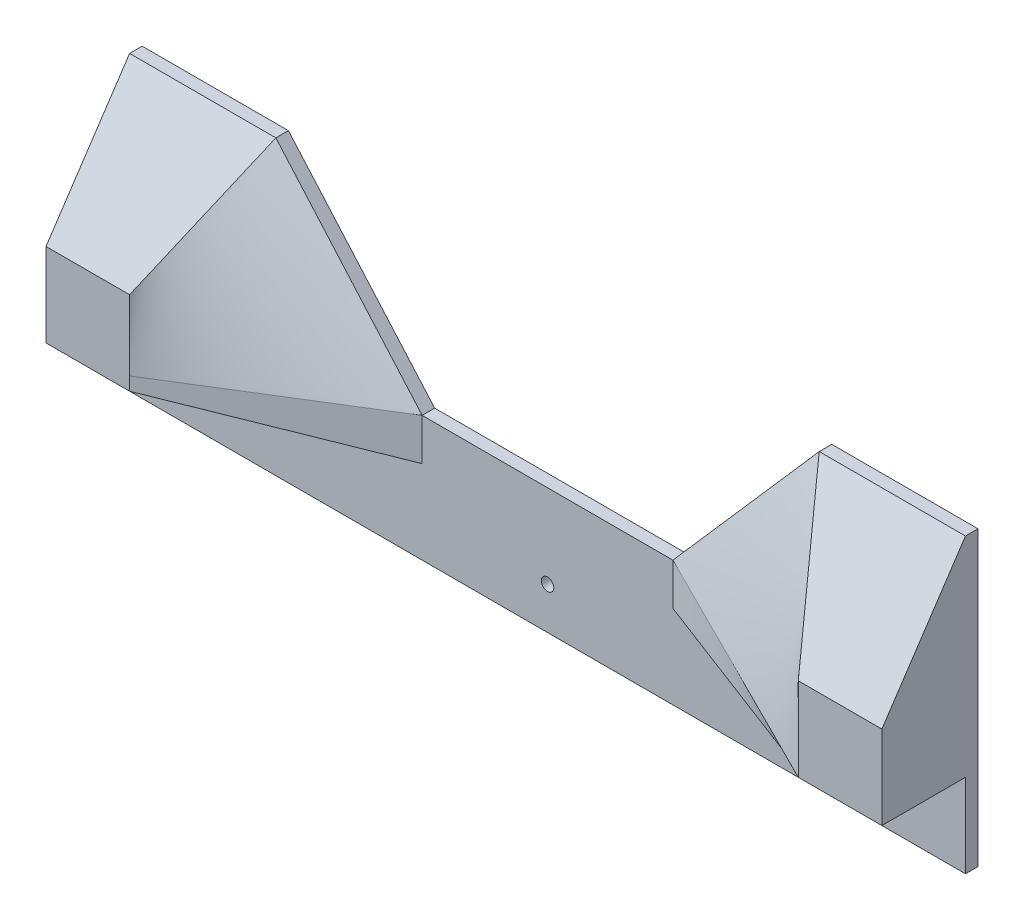
ISO-10303-21;
HEADER;
FILE_DESCRIPTION(('STEP AP214'),'2;1');
FILE_NAME('part.step','',(''),(''),'','','');
FILE_SCHEMA(('AUTOMOTIVE_DESIGN { 1 0 10303 214 1 1 1 1 }'));
ENDSEC;
DATA;
#1=APPLICATION_CONTEXT('core data for automotive mechanical design processes');
#2=APPLICATION_PROTOCOL_DEFINITION('international standard','automotive_design',2000,#1);
#3=PRODUCT_CONTEXT('',#1,'mechanical');
#4=PRODUCT('Part','Part','',(#3));
#5=PRODUCT_RELATED_PRODUCT_CATEGORY('part','',(#4));
#6=PRODUCT_DEFINITION_FORMATION('','',#4);
#7=PRODUCT_DEFINITION_CONTEXT('part definition',#1,'design');
#8=PRODUCT_DEFINITION('design','',#6,#7);
#9=PRODUCT_DEFINITION_SHAPE('','',#8);
#10=(LENGTH_UNIT() NAMED_UNIT(*) SI_UNIT(.MILLI.,.METRE.));
#11=(NAMED_UNIT(*) PLANE_ANGLE_UNIT() SI_UNIT($,.RADIAN.));
#12=(NAMED_UNIT(*) SI_UNIT($,.STERADIAN.) SOLID_ANGLE_UNIT());
#13=UNCERTAINTY_MEASURE_WITH_UNIT(LENGTH_MEASURE(1.E-05),#10,'distance_accuracy_value','');
#14=(GEOMETRIC_REPRESENTATION_CONTEXT(3) GLOBAL_UNCERTAINTY_ASSIGNED_CONTEXT((#13)) GLOBAL_UNIT_ASSIGNED_CONTEXT((#10,
#11,#12)) REPRESENTATION_CONTEXT('',''));
#15=CARTESIAN_POINT('',(0.,0.,0.));
#16=DIRECTION('',(0.,0.,1.));
#17=DIRECTION('',(1.,0.,0.));
#18=AXIS2_PLACEMENT_3D('',#15,#16,#17);
#19=CARTESIAN_POINT('',(0.,0.,3.));
#20=DIRECTION('',(0.,0.,1.));
#21=DIRECTION('',(1.,0.,0.));
#22=AXIS2_PLACEMENT_3D('',#19,#20,#21);
#23=PLANE('',#22);
#24=CARTESIAN_POINT('',(185.,-20.,3.));
#25=DIRECTION('',(0.,0.,1.));
#26=DIRECTION('',(1.,0.,0.));
#27=AXIS2_PLACEMENT_3D('',#24,#25,#26);
#28=CIRCLE('',#27,1.5);
#29=CARTESIAN_POINT('',(186.5,-20.,3.));
#30=VERTEX_POINT('',#29);
#31=EDGE_CURVE('E412',#30,#30,#28,.T.);
#32=ORIENTED_EDGE('',*,*,#31,.F.);
#33=EDGE_LOOP('',(#32));
#34=FACE_BOUND('',#33,.T.);
#35=CARTESIAN_POINT('',(100.,-20.,3.));
#36=DIRECTION('',(0.,0.,1.));
#37=DIRECTION('',(1.,0.,0.));
#38=AXIS2_PLACEMENT_3D('',#35,#36,#37);
#39=CIRCLE('',#38,1.5);
#40=CARTESIAN_POINT('',(101.5,-20.,3.));
#41=VERTEX_POINT('',#40);
#42=EDGE_CURVE('E415',#41,#41,#39,.T.);
#43=ORIENTED_EDGE('',*,*,#42,.F.);
#44=EDGE_LOOP('',(#43));
#45=FACE_BOUND('',#44,.T.);
#46=CARTESIAN_POINT('',(15.,-20.,3.));
#47=DIRECTION('',(0.,0.,1.));
#48=DIRECTION('',(-1.,0.,0.));
#49=AXIS2_PLACEMENT_3D('',#46,#47,#48);
#50=CIRCLE('',#49,1.5);
#51=CARTESIAN_POINT('',(16.5,-20.,3.));
#52=VERTEX_POINT('',#51);
#53=EDGE_CURVE('E421',#52,#52,#50,.T.);
#54=ORIENTED_EDGE('',*,*,#53,.F.);
#55=EDGE_LOOP('',(#54));
#56=FACE_BOUND('',#55,.T.);
#57=DIRECTION('',(1.,0.,0.));
#58=VECTOR('',#57,1.);
#59=CARTESIAN_POINT('',(200.,-10.,3.));
#60=LINE('',#59,#58);
#61=CARTESIAN_POINT('',(130.,-10.,3.));
#62=VERTEX_POINT('',#61);
#63=CARTESIAN_POINT('',(200.,-10.,3.));
#64=VERTEX_POINT('',#63);
#65=EDGE_CURVE('E116',#62,#64,#60,.T.);
#66=ORIENTED_EDGE('',*,*,#65,.F.);
#67=DIRECTION('',(0.,-1.,0.));
#68=VECTOR('',#67,1.);
#69=CARTESIAN_POINT('',(130.,0.,3.));
#70=LINE('',#69,#68);
#71=CARTESIAN_POINT('',(130.,0.,3.));
#72=VERTEX_POINT('',#71);
#73=EDGE_CURVE('E200',#72,#62,#70,.T.);
#74=ORIENTED_EDGE('',*,*,#73,.F.);
#75=DIRECTION('',(1.,0.,0.));
#76=VECTOR('',#75,1.);
#77=CARTESIAN_POINT('',(0.,0.,3.));
#78=LINE('',#77,#76);
#79=CARTESIAN_POINT('',(70.,0.,3.00000000000001));
#80=VERTEX_POINT('',#79);
#81=EDGE_CURVE('E190',#80,#72,#78,.T.);
#82=ORIENTED_EDGE('',*,*,#81,.F.);
#83=DIRECTION('',(0.,1.,0.));
#84=VECTOR('',#83,1.);
#85=CARTESIAN_POINT('',(70.,-10.,3.));
#86=LINE('',#85,#84);
#87=CARTESIAN_POINT('',(70.,-10.,3.));
#88=VERTEX_POINT('',#87);
#89=EDGE_CURVE('E198',#88,#80,#86,.T.);
#90=ORIENTED_EDGE('',*,*,#89,.F.);
#91=DIRECTION('',(1.,0.,0.));
#92=VECTOR('',#91,1.);
#93=CARTESIAN_POINT('',(0.,-10.,3.));
#94=LINE('',#93,#92);
#95=CARTESIAN_POINT('',(0.,-10.,3.));
#96=VERTEX_POINT('',#95);
#97=EDGE_CURVE('E339',#96,#88,#94,.T.);
#98=ORIENTED_EDGE('',*,*,#97,.F.);
#99=DIRECTION('',(0.,-1.,0.));
#100=VECTOR('',#99,1.);
#101=CARTESIAN_POINT('',(0.,0.,3.));
#102=LINE('',#101,#100);
#103=CARTESIAN_POINT('',(0.,-30.,3.));
#104=VERTEX_POINT('',#103);
#105=EDGE_CURVE('E347',#96,#104,#102,.T.);
#106=ORIENTED_EDGE('',*,*,#105,.T.);
#107=DIRECTION('',(1.,0.,0.));
#108=VECTOR('',#107,1.);
#109=CARTESIAN_POINT('',(0.,-30.,3.));
#110=LINE('',#109,#108);
#111=CARTESIAN_POINT('',(200.,-30.,3.));
#112=VERTEX_POINT('',#111);
#113=EDGE_CURVE('E350',#104,#112,#110,.T.);
#114=ORIENTED_EDGE('',*,*,#113,.T.);
#115=DIRECTION('',(0.,-1.,0.));
#116=VECTOR('',#115,1.);
#117=CARTESIAN_POINT('',(200.,0.,3.));
#118=LINE('',#117,#116);
#119=EDGE_CURVE('E381',#64,#112,#118,.T.);
#120=ORIENTED_EDGE('',*,*,#119,.F.);
#121=EDGE_LOOP('',(#66,#74,#82,#90,#98,#106,#114,#120));
#122=FACE_BOUND('',#121,.T.);
#123=ADVANCED_FACE('F72',(#34,#45,#56,#122),#23,.T.);
#124=CARTESIAN_POINT('',(200.,0.,3.));
#125=DIRECTION('',(1.,0.,0.));
#126=DIRECTION('',(0.,0.,-1.));
#127=AXIS2_PLACEMENT_3D('',#124,#125,#126);
#128=PLANE('',#127);
#129=DIRECTION('',(0.,0.832050294337844,-0.554700196225229));
#130=VECTOR('',#129,1.);
#131=CARTESIAN_POINT('',(200.,10.,23.));
#132=LINE('',#131,#130);
#133=CARTESIAN_POINT('',(200.,10.,23.));
#134=VERTEX_POINT('',#133);
#135=CARTESIAN_POINT('',(200.,40.,3.));
#136=VERTEX_POINT('',#135);
#137=EDGE_CURVE('E105',#134,#136,#132,.T.);
#138=ORIENTED_EDGE('',*,*,#137,.F.);
#139=DIRECTION('',(0.,1.,0.));
#140=VECTOR('',#139,1.);
#141=CARTESIAN_POINT('',(200.,-10.,23.));
#142=LINE('',#141,#140);
#143=CARTESIAN_POINT('',(200.,-10.,23.));
#144=VERTEX_POINT('',#143);
#145=EDGE_CURVE('E391',#144,#134,#142,.T.);
#146=ORIENTED_EDGE('',*,*,#145,.F.);
#147=DIRECTION('',(0.,0.,-1.));
#148=VECTOR('',#147,1.);
#149=CARTESIAN_POINT('',(200.,-10.,23.));
#150=LINE('',#149,#148);
#151=EDGE_CURVE('E220',#144,#64,#150,.T.);
#152=ORIENTED_EDGE('',*,*,#151,.T.);
#153=ORIENTED_EDGE('',*,*,#119,.T.);
#154=DIRECTION('',(0.,0.,-1.));
#155=VECTOR('',#154,1.);
#156=CARTESIAN_POINT('',(200.,-30.,3.));
#157=LINE('',#156,#155);
#158=CARTESIAN_POINT('',(200.,-30.,0.));
#159=VERTEX_POINT('',#158);
#160=EDGE_CURVE('E360',#112,#159,#157,.T.);
#161=ORIENTED_EDGE('',*,*,#160,.T.);
#162=DIRECTION('',(0.,-1.,0.));
#163=VECTOR('',#162,1.);
#164=CARTESIAN_POINT('',(200.,0.,0.));
#165=LINE('',#164,#163);
#166=CARTESIAN_POINT('',(200.,40.,0.));
#167=VERTEX_POINT('',#166);
#168=EDGE_CURVE('E361',#167,#159,#165,.T.);
#169=ORIENTED_EDGE('',*,*,#168,.F.);
#170=DIRECTION('',(0.,0.,-1.));
#171=VECTOR('',#170,1.);
#172=CARTESIAN_POINT('',(200.,40.,3.));
#173=LINE('',#172,#171);
#174=EDGE_CURVE('E82',#136,#167,#173,.T.);
#175=ORIENTED_EDGE('',*,*,#174,.F.);
#176=EDGE_LOOP('',(#138,#146,#152,#153,#161,#169,#175));
#177=FACE_BOUND('',#176,.T.);
#178=ADVANCED_FACE('F74',(#177),#128,.T.);
#179=CARTESIAN_POINT('',(0.,40.,3.));
#180=DIRECTION('',(0.,-1.,0.));
#181=DIRECTION('',(1.,0.,0.));
#182=AXIS2_PLACEMENT_3D('',#179,#180,#181);
#183=PLANE('',#182);
#184=DIRECTION('',(-1.,0.,0.));
#185=VECTOR('',#184,1.);
#186=CARTESIAN_POINT('',(0.,40.,0.));
#187=LINE('',#186,#185);
#188=CARTESIAN_POINT('',(165.,40.,0.));
#189=VERTEX_POINT('',#188);
#190=EDGE_CURVE('E364',#167,#189,#187,.T.);
#191=ORIENTED_EDGE('',*,*,#190,.T.);
#192=DIRECTION('',(0.,0.,-1.));
#193=VECTOR('',#192,1.);
#194=CARTESIAN_POINT('',(165.,40.,3.));
#195=LINE('',#194,#193);
#196=CARTESIAN_POINT('',(165.,40.,3.));
#197=VERTEX_POINT('',#196);
#198=EDGE_CURVE('E402',#197,#189,#195,.T.);
#199=ORIENTED_EDGE('',*,*,#198,.F.);
#200=DIRECTION('',(1.,0.,0.));
#201=VECTOR('',#200,1.);
#202=CARTESIAN_POINT('',(0.,40.,2.99999999999999));
#203=LINE('',#202,#201);
#204=EDGE_CURVE('E400',#136,#197,#203,.F.);
#205=ORIENTED_EDGE('',*,*,#204,.F.);
#206=ORIENTED_EDGE('',*,*,#174,.T.);
#207=EDGE_LOOP('',(#191,#199,#205,#206));
#208=FACE_BOUND('',#207,.T.);
#209=ADVANCED_FACE('F436',(#208),#183,.F.);
#210=CARTESIAN_POINT('',(73.6283185840708,-64.424778761062,3.));
#211=DIRECTION('',(0.752576694706878,-0.658504607868518,0.));
#212=DIRECTION('',(0.658504607868518,0.752576694706878,0.));
#213=AXIS2_PLACEMENT_3D('',#210,#211,#212);
#214=PLANE('',#213);
#215=DIRECTION('',(-0.658504607868518,-0.752576694706878,0.));
#216=VECTOR('',#215,1.);
#217=CARTESIAN_POINT('',(73.6283185840708,-64.424778761062,0.));
#218=LINE('',#217,#216);
#219=CARTESIAN_POINT('',(130.,0.,0.));
#220=VERTEX_POINT('',#219);
#221=EDGE_CURVE('E367',#189,#220,#218,.T.);
#222=ORIENTED_EDGE('',*,*,#221,.T.);
#223=DIRECTION('',(0.,0.,-1.));
#224=VECTOR('',#223,1.);
#225=CARTESIAN_POINT('',(130.,0.,3.));
#226=LINE('',#225,#224);
#227=EDGE_CURVE('E194',#72,#220,#226,.T.);
#228=ORIENTED_EDGE('',*,*,#227,.F.);
#229=DIRECTION('',(0.658504607868518,0.752576694706878,0.));
#230=VECTOR('',#229,1.);
#231=CARTESIAN_POINT('',(73.6283185840708,-64.424778761062,3.));
#232=LINE('',#231,#230);
#233=EDGE_CURVE('E203',#197,#72,#232,.F.);
#234=ORIENTED_EDGE('',*,*,#233,.F.);
#235=ORIENTED_EDGE('',*,*,#198,.T.);
#236=EDGE_LOOP('',(#222,#228,#234,#235));
#237=FACE_BOUND('',#236,.T.);
#238=ADVANCED_FACE('F463',(#237),#214,.F.);
#239=CARTESIAN_POINT('',(0.,0.,3.));
#240=DIRECTION('',(0.,1.,0.));
#241=DIRECTION('',(0.,0.,1.));
#242=AXIS2_PLACEMENT_3D('',#239,#240,#241);
#243=PLANE('',#242);
#244=DIRECTION('',(1.,0.,0.));
#245=VECTOR('',#244,1.);
#246=CARTESIAN_POINT('',(0.,0.,0.));
#247=LINE('',#246,#245);
#248=CARTESIAN_POINT('',(70.,0.,0.));
#249=VERTEX_POINT('',#248);
#250=EDGE_CURVE('E192',#249,#220,#247,.T.);
#251=ORIENTED_EDGE('',*,*,#250,.F.);
#252=DIRECTION('',(0.,0.,-1.));
#253=VECTOR('',#252,1.);
#254=CARTESIAN_POINT('',(70.,0.,3.));
#255=LINE('',#254,#253);
#256=EDGE_CURVE('E187',#80,#249,#255,.T.);
#257=ORIENTED_EDGE('',*,*,#256,.F.);
#258=ORIENTED_EDGE('',*,*,#81,.T.);
#259=ORIENTED_EDGE('',*,*,#227,.T.);
#260=EDGE_LOOP('',(#251,#257,#258,#259));
#261=FACE_BOUND('',#260,.T.);
#262=ADVANCED_FACE('F189',(#261),#243,.T.);
#263=CARTESIAN_POINT('',(39.646017699115,34.6902654867257,3.));
#264=DIRECTION('',(0.752576694706878,0.658504607868518,0.));
#265=DIRECTION('',(-0.658504607868518,0.752576694706878,0.));
#266=AXIS2_PLACEMENT_3D('',#263,#264,#265);
#267=PLANE('',#266);
#268=DIRECTION('',(0.658504607868518,-0.752576694706878,0.));
#269=VECTOR('',#268,1.);
#270=CARTESIAN_POINT('',(39.646017699115,34.6902654867257,0.));
#271=LINE('',#270,#269);
#272=CARTESIAN_POINT('',(35.,40.,0.));
#273=VERTEX_POINT('',#272);
#274=EDGE_CURVE('E371',#273,#249,#271,.T.);
#275=ORIENTED_EDGE('',*,*,#274,.F.);
#276=DIRECTION('',(0.,0.,-1.));
#277=VECTOR('',#276,1.);
#278=CARTESIAN_POINT('',(35.,40.,3.));
#279=LINE('',#278,#277);
#280=CARTESIAN_POINT('',(35.,40.,3.));
#281=VERTEX_POINT('',#280);
#282=EDGE_CURVE('E181',#281,#273,#279,.T.);
#283=ORIENTED_EDGE('',*,*,#282,.F.);
#284=DIRECTION('',(-0.658504607868518,0.752576694706878,0.));
#285=VECTOR('',#284,1.);
#286=CARTESIAN_POINT('',(39.646017699115,34.6902654867257,3.));
#287=LINE('',#286,#285);
#288=EDGE_CURVE('E202',#281,#80,#287,.F.);
#289=ORIENTED_EDGE('',*,*,#288,.T.);
#290=ORIENTED_EDGE('',*,*,#256,.T.);
#291=EDGE_LOOP('',(#275,#283,#289,#290));
#292=FACE_BOUND('',#291,.T.);
#293=ADVANCED_FACE('F206',(#292),#267,.T.);
#294=CARTESIAN_POINT('',(0.,40.,3.));
#295=DIRECTION('',(0.,1.,0.));
#296=DIRECTION('',(-1.,0.,0.));
#297=AXIS2_PLACEMENT_3D('',#294,#295,#296);
#298=PLANE('',#297);
#299=DIRECTION('',(1.,0.,0.));
#300=VECTOR('',#299,1.);
#301=CARTESIAN_POINT('',(0.,40.,0.));
#302=LINE('',#301,#300);
#303=CARTESIAN_POINT('',(0.,40.,0.));
#304=VERTEX_POINT('',#303);
#305=EDGE_CURVE('E373',#304,#273,#302,.T.);
#306=ORIENTED_EDGE('',*,*,#305,.F.);
#307=DIRECTION('',(0.,0.,-1.));
#308=VECTOR('',#307,1.);
#309=CARTESIAN_POINT('',(0.,40.,3.));
#310=LINE('',#309,#308);
#311=CARTESIAN_POINT('',(0.,40.,3.));
#312=VERTEX_POINT('',#311);
#313=EDGE_CURVE('E385',#312,#304,#310,.T.);
#314=ORIENTED_EDGE('',*,*,#313,.F.);
#315=DIRECTION('',(-1.,0.,0.));
#316=VECTOR('',#315,1.);
#317=CARTESIAN_POINT('',(0.,40.,3.));
#318=LINE('',#317,#316);
#319=EDGE_CURVE('E211',#312,#281,#318,.F.);
#320=ORIENTED_EDGE('',*,*,#319,.T.);
#321=ORIENTED_EDGE('',*,*,#282,.T.);
#322=EDGE_LOOP('',(#306,#314,#320,#321));
#323=FACE_BOUND('',#322,.T.);
#324=ADVANCED_FACE('F454',(#323),#298,.T.);
#325=CARTESIAN_POINT('',(0.,0.,3.));
#326=DIRECTION('',(1.,0.,0.));
#327=DIRECTION('',(0.,1.,0.));
#328=AXIS2_PLACEMENT_3D('',#325,#326,#327);
#329=PLANE('',#328);
#330=DIRECTION('',(0.,-1.,0.));
#331=VECTOR('',#330,1.);
#332=CARTESIAN_POINT('',(0.,-10.,23.));
#333=LINE('',#332,#331);
#334=CARTESIAN_POINT('',(0.,10.,23.));
#335=VERTEX_POINT('',#334);
#336=CARTESIAN_POINT('',(0.,-10.,23.));
#337=VERTEX_POINT('',#336);
#338=EDGE_CURVE('E306',#335,#337,#333,.T.);
#339=ORIENTED_EDGE('',*,*,#338,.F.);
#340=DIRECTION('',(0.,-0.832050294337844,0.554700196225229));
#341=VECTOR('',#340,1.);
#342=CARTESIAN_POINT('',(0.,25.,13.));
#343=LINE('',#342,#341);
#344=EDGE_CURVE('E229',#312,#335,#343,.T.);
#345=ORIENTED_EDGE('',*,*,#344,.F.);
#346=ORIENTED_EDGE('',*,*,#313,.T.);
#347=DIRECTION('',(0.,-1.,0.));
#348=VECTOR('',#347,1.);
#349=CARTESIAN_POINT('',(0.,0.,0.));
#350=LINE('',#349,#348);
#351=CARTESIAN_POINT('',(0.,-30.,0.));
#352=VERTEX_POINT('',#351);
#353=EDGE_CURVE('E376',#304,#352,#350,.T.);
#354=ORIENTED_EDGE('',*,*,#353,.T.);
#355=DIRECTION('',(0.,0.,-1.));
#356=VECTOR('',#355,1.);
#357=CARTESIAN_POINT('',(0.,-30.,3.));
#358=LINE('',#357,#356);
#359=EDGE_CURVE('E383',#104,#352,#358,.T.);
#360=ORIENTED_EDGE('',*,*,#359,.F.);
#361=ORIENTED_EDGE('',*,*,#105,.F.);
#362=DIRECTION('',(0.,0.,-1.));
#363=VECTOR('',#362,1.);
#364=CARTESIAN_POINT('',(0.,-10.,23.));
#365=LINE('',#364,#363);
#366=EDGE_CURVE('E337',#337,#96,#365,.T.);
#367=ORIENTED_EDGE('',*,*,#366,.F.);
#368=EDGE_LOOP('',(#339,#345,#346,#354,#360,#361,#367));
#369=FACE_BOUND('',#368,.T.);
#370=ADVANCED_FACE('F450',(#369),#329,.F.);
#371=CARTESIAN_POINT('',(0.,-30.,3.));
#372=DIRECTION('',(0.,1.,0.));
#373=DIRECTION('',(0.,0.,1.));
#374=AXIS2_PLACEMENT_3D('',#371,#372,#373);
#375=PLANE('',#374);
#376=DIRECTION('',(1.,0.,0.));
#377=VECTOR('',#376,1.);
#378=CARTESIAN_POINT('',(0.,-30.,0.));
#379=LINE('',#378,#377);
#380=EDGE_CURVE('E378',#352,#159,#379,.T.);
#381=ORIENTED_EDGE('',*,*,#380,.T.);
#382=ORIENTED_EDGE('',*,*,#160,.F.);
#383=ORIENTED_EDGE('',*,*,#113,.F.);
#384=ORIENTED_EDGE('',*,*,#359,.T.);
#385=EDGE_LOOP('',(#381,#382,#383,#384));
#386=FACE_BOUND('',#385,.T.);
#387=ADVANCED_FACE('F446',(#386),#375,.F.);
#388=CARTESIAN_POINT('',(0.,0.,0.));
#389=DIRECTION('',(0.,0.,1.));
#390=DIRECTION('',(1.,0.,0.));
#391=AXIS2_PLACEMENT_3D('',#388,#389,#390);
#392=PLANE('',#391);
#393=CARTESIAN_POINT('',(185.,-20.,0.));
#394=DIRECTION('',(0.,0.,1.));
#395=DIRECTION('',(1.,0.,0.));
#396=AXIS2_PLACEMENT_3D('',#393,#394,#395);
#397=CIRCLE('',#396,1.5);
#398=CARTESIAN_POINT('',(186.5,-20.,0.));
#399=VERTEX_POINT('',#398);
#400=EDGE_CURVE('E365',#399,#399,#397,.F.);
#401=ORIENTED_EDGE('',*,*,#400,.F.);
#402=EDGE_LOOP('',(#401));
#403=FACE_BOUND('',#402,.T.);
#404=CARTESIAN_POINT('',(100.,-20.,0.));
#405=DIRECTION('',(0.,0.,1.));
#406=DIRECTION('',(1.,0.,0.));
#407=AXIS2_PLACEMENT_3D('',#404,#405,#406);
#408=CIRCLE('',#407,1.5);
#409=CARTESIAN_POINT('',(101.5,-20.,0.));
#410=VERTEX_POINT('',#409);
#411=EDGE_CURVE('E418',#410,#410,#408,.F.);
#412=ORIENTED_EDGE('',*,*,#411,.F.);
#413=EDGE_LOOP('',(#412));
#414=FACE_BOUND('',#413,.T.);
#415=CARTESIAN_POINT('',(15.,-20.,0.));
#416=DIRECTION('',(0.,0.,1.));
#417=DIRECTION('',(1.,0.,0.));
#418=AXIS2_PLACEMENT_3D('',#415,#416,#417);
#419=CIRCLE('',#418,1.5);
#420=CARTESIAN_POINT('',(16.5,-20.,0.));
#421=VERTEX_POINT('',#420);
#422=EDGE_CURVE('E346',#421,#421,#419,.F.);
#423=ORIENTED_EDGE('',*,*,#422,.F.);
#424=EDGE_LOOP('',(#423));
#425=FACE_BOUND('',#424,.T.);
#426=ORIENTED_EDGE('',*,*,#168,.T.);
#427=ORIENTED_EDGE('',*,*,#380,.F.);
#428=ORIENTED_EDGE('',*,*,#353,.F.);
#429=ORIENTED_EDGE('',*,*,#305,.T.);
#430=ORIENTED_EDGE('',*,*,#274,.T.);
#431=ORIENTED_EDGE('',*,*,#250,.T.);
#432=ORIENTED_EDGE('',*,*,#221,.F.);
#433=ORIENTED_EDGE('',*,*,#190,.F.);
#434=EDGE_LOOP('',(#426,#427,#428,#429,#430,#431,#432,#433));
#435=FACE_BOUND('',#434,.T.);
#436=ADVANCED_FACE('F443',(#403,#414,#425,#435),#392,.F.);
#437=CARTESIAN_POINT('',(15.,-20.,-4.24264068711928));
#438=DIRECTION('',(0.,0.,1.));
#439=DIRECTION('',(1.,0.,0.));
#440=AXIS2_PLACEMENT_3D('',#437,#438,#439);
#441=CYLINDRICAL_SURFACE('',#440,1.5);
#442=CARTESIAN_POINT('',(16.5,-20.,0.));
#443=CARTESIAN_POINT('',(16.5,-20.,0.0312499999999992));
#444=CARTESIAN_POINT('',(16.5,-20.,0.0624999999999992));
#445=CARTESIAN_POINT('',(16.5,-20.,0.124999999999999));
#446=CARTESIAN_POINT('',(16.5,-20.,0.156249999999999));
#447=CARTESIAN_POINT('',(16.5,-20.,0.218749999999999));
#448=CARTESIAN_POINT('',(16.5,-20.,0.249999999999999));
#449=CARTESIAN_POINT('',(16.5,-20.,0.312499999999999));
#450=CARTESIAN_POINT('',(16.5,-20.,0.343749999999999));
#451=CARTESIAN_POINT('',(16.5,-20.,0.40625));
#452=CARTESIAN_POINT('',(16.5,-20.,0.4375));
#453=CARTESIAN_POINT('',(16.5,-20.,0.5));
#454=CARTESIAN_POINT('',(16.5,-20.,0.53125));
#455=CARTESIAN_POINT('',(16.5,-20.,0.59375));
#456=CARTESIAN_POINT('',(16.5,-20.,0.625));
#457=CARTESIAN_POINT('',(16.5,-20.,0.6875));
#458=CARTESIAN_POINT('',(16.5,-20.,0.71875));
#459=CARTESIAN_POINT('',(16.5,-20.,0.78125));
#460=CARTESIAN_POINT('',(16.5,-20.,0.8125));
#461=CARTESIAN_POINT('',(16.5,-20.,0.875));
#462=CARTESIAN_POINT('',(16.5,-20.,0.906249999999999));
#463=CARTESIAN_POINT('',(16.5,-20.,0.968749999999999));
#464=CARTESIAN_POINT('',(16.5,-20.,0.999999999999999));
#465=CARTESIAN_POINT('',(16.5,-20.,1.0625));
#466=CARTESIAN_POINT('',(16.5,-20.,1.09375));
#467=CARTESIAN_POINT('',(16.5,-20.,1.15625));
#468=CARTESIAN_POINT('',(16.5,-20.,1.1875));
#469=CARTESIAN_POINT('',(16.5,-20.,1.25));
#470=CARTESIAN_POINT('',(16.5,-20.,1.28125));
#471=CARTESIAN_POINT('',(16.5,-20.,1.34375));
#472=CARTESIAN_POINT('',(16.5,-20.,1.375));
#473=CARTESIAN_POINT('',(16.5,-20.,1.4375));
#474=CARTESIAN_POINT('',(16.5,-20.,1.46875));
#475=CARTESIAN_POINT('',(16.5,-20.,1.53125));
#476=CARTESIAN_POINT('',(16.5,-20.,1.5625));
#477=CARTESIAN_POINT('',(16.5,-20.,1.625));
#478=CARTESIAN_POINT('',(16.5,-20.,1.65625));
#479=CARTESIAN_POINT('',(16.5,-20.,1.71875));
#480=CARTESIAN_POINT('',(16.5,-20.,1.75));
#481=CARTESIAN_POINT('',(16.5,-20.,1.8125));
#482=CARTESIAN_POINT('',(16.5,-20.,1.84375));
#483=CARTESIAN_POINT('',(16.5,-20.,1.90625));
#484=CARTESIAN_POINT('',(16.5,-20.,1.9375));
#485=CARTESIAN_POINT('',(16.5,-20.,2.));
#486=CARTESIAN_POINT('',(16.5,-20.,2.03125));
#487=CARTESIAN_POINT('',(16.5,-20.,2.09375));
#488=CARTESIAN_POINT('',(16.5,-20.,2.125));
#489=CARTESIAN_POINT('',(16.5,-20.,2.1875));
#490=CARTESIAN_POINT('',(16.5,-20.,2.21875));
#491=CARTESIAN_POINT('',(16.5,-20.,2.28125));
#492=CARTESIAN_POINT('',(16.5,-20.,2.3125));
#493=CARTESIAN_POINT('',(16.5,-20.,2.375));
#494=CARTESIAN_POINT('',(16.5,-20.,2.40625));
#495=CARTESIAN_POINT('',(16.5,-20.,2.46875));
#496=CARTESIAN_POINT('',(16.5,-20.,2.5));
#497=CARTESIAN_POINT('',(16.5,-20.,2.5625));
#498=CARTESIAN_POINT('',(16.5,-20.,2.59375));
#499=CARTESIAN_POINT('',(16.5,-20.,2.65625));
#500=CARTESIAN_POINT('',(16.5,-20.,2.6875));
#501=CARTESIAN_POINT('',(16.5,-20.,2.75));
#502=CARTESIAN_POINT('',(16.5,-20.,2.78125));
#503=CARTESIAN_POINT('',(16.5,-20.,2.84375));
#504=CARTESIAN_POINT('',(16.5,-20.,2.875));
#505=CARTESIAN_POINT('',(16.5,-20.,2.9375));
#506=CARTESIAN_POINT('',(16.5,-20.,2.96875));
#507=CARTESIAN_POINT('',(16.5,-20.,3.));
#508=B_SPLINE_CURVE_WITH_KNOTS('',3,(#442,#443,#444,#445,#446,#447,#448,#449,#450,#451,#452,
#453,#454,#455,#456,#457,#458,#459,#460,#461,#462,#463,#464,#465,#466,#467,#468,#469,#470,#471,
#472,#473,#474,#475,#476,#477,#478,#479,#480,#481,#482,#483,#484,#485,#486,#487,#488,#489,#490,
#491,#492,#493,#494,#495,#496,#497,#498,#499,#500,#501,#502,#503,#504,#505,#506,#507),
.UNSPECIFIED.,.F.,.F.,(4,2,2,2,2,2,2,2,2,2,2,2,2,2,2,2,2,2,2,2,2,2,2,2,2,2,2,2,2,2,2,2,4),(0.,
0.0937500000000001,0.1875,0.28125,0.375,0.46875,0.5625,0.656250000000001,0.750000000000001,
0.843750000000001,0.9375,1.03125,1.125,1.21875,1.3125,1.40625,1.5,1.59375,1.6875,1.78125,1.875,
1.96875,2.0625,2.15625,2.25,2.34375,2.4375,2.53125,2.625,2.71875,2.8125,2.90625,3.),.UNSPECIFIED.);
#509=EDGE_CURVE('BSEAM428',#421,#52,#508,.T.);
#510=ORIENTED_EDGE('',*,*,#422,.T.);
#511=ORIENTED_EDGE('',*,*,#53,.T.);
#512=ORIENTED_EDGE('',*,*,#509,.T.);
#513=ORIENTED_EDGE('',*,*,#509,.F.);
#514=EDGE_LOOP('',(#510,#512,#511,#513));
#515=FACE_BOUND('',#514,.T.);
#516=ADVANCED_FACE('F428',(#515),#441,.F.);
#517=CARTESIAN_POINT('',(100.,-20.,-4.24264068711928));
#518=DIRECTION('',(0.,0.,1.));
#519=DIRECTION('',(1.,0.,0.));
#520=AXIS2_PLACEMENT_3D('',#517,#518,#519);
#521=CYLINDRICAL_SURFACE('',#520,1.5);
#522=CARTESIAN_POINT('',(101.5,-20.,0.));
#523=CARTESIAN_POINT('',(101.5,-20.,0.0312499999999992));
#524=CARTESIAN_POINT('',(101.5,-20.,0.0624999999999992));
#525=CARTESIAN_POINT('',(101.5,-20.,0.124999999999999));
#526=CARTESIAN_POINT('',(101.5,-20.,0.156249999999999));
#527=CARTESIAN_POINT('',(101.5,-20.,0.218749999999999));
#528=CARTESIAN_POINT('',(101.5,-20.,0.249999999999999));
#529=CARTESIAN_POINT('',(101.5,-20.,0.312499999999999));
#530=CARTESIAN_POINT('',(101.5,-20.,0.343749999999999));
#531=CARTESIAN_POINT('',(101.5,-20.,0.40625));
#532=CARTESIAN_POINT('',(101.5,-20.,0.4375));
#533=CARTESIAN_POINT('',(101.5,-20.,0.5));
#534=CARTESIAN_POINT('',(101.5,-20.,0.53125));
#535=CARTESIAN_POINT('',(101.5,-20.,0.59375));
#536=CARTESIAN_POINT('',(101.5,-20.,0.625));
#537=CARTESIAN_POINT('',(101.5,-20.,0.6875));
#538=CARTESIAN_POINT('',(101.5,-20.,0.71875));
#539=CARTESIAN_POINT('',(101.5,-20.,0.78125));
#540=CARTESIAN_POINT('',(101.5,-20.,0.8125));
#541=CARTESIAN_POINT('',(101.5,-20.,0.875));
#542=CARTESIAN_POINT('',(101.5,-20.,0.906249999999999));
#543=CARTESIAN_POINT('',(101.5,-20.,0.968749999999999));
#544=CARTESIAN_POINT('',(101.5,-20.,0.999999999999999));
#545=CARTESIAN_POINT('',(101.5,-20.,1.0625));
#546=CARTESIAN_POINT('',(101.5,-20.,1.09375));
#547=CARTESIAN_POINT('',(101.5,-20.,1.15625));
#548=CARTESIAN_POINT('',(101.5,-20.,1.1875));
#549=CARTESIAN_POINT('',(101.5,-20.,1.25));
#550=CARTESIAN_POINT('',(101.5,-20.,1.28125));
#551=CARTESIAN_POINT('',(101.5,-20.,1.34375));
#552=CARTESIAN_POINT('',(101.5,-20.,1.375));
#553=CARTESIAN_POINT('',(101.5,-20.,1.4375));
#554=CARTESIAN_POINT('',(101.5,-20.,1.46875));
#555=CARTESIAN_POINT('',(101.5,-20.,1.53125));
#556=CARTESIAN_POINT('',(101.5,-20.,1.5625));
#557=CARTESIAN_POINT('',(101.5,-20.,1.625));
#558=CARTESIAN_POINT('',(101.5,-20.,1.65625));
#559=CARTESIAN_POINT('',(101.5,-20.,1.71875));
#560=CARTESIAN_POINT('',(101.5,-20.,1.75));
#561=CARTESIAN_POINT('',(101.5,-20.,1.8125));
#562=CARTESIAN_POINT('',(101.5,-20.,1.84375));
#563=CARTESIAN_POINT('',(101.5,-20.,1.90625));
#564=CARTESIAN_POINT('',(101.5,-20.,1.9375));
#565=CARTESIAN_POINT('',(101.5,-20.,2.));
#566=CARTESIAN_POINT('',(101.5,-20.,2.03125));
#567=CARTESIAN_POINT('',(101.5,-20.,2.09375));
#568=CARTESIAN_POINT('',(101.5,-20.,2.125));
#569=CARTESIAN_POINT('',(101.5,-20.,2.1875));
#570=CARTESIAN_POINT('',(101.5,-20.,2.21875));
#571=CARTESIAN_POINT('',(101.5,-20.,2.28125));
#572=CARTESIAN_POINT('',(101.5,-20.,2.3125));
#573=CARTESIAN_POINT('',(101.5,-20.,2.375));
#574=CARTESIAN_POINT('',(101.5,-20.,2.40625));
#575=CARTESIAN_POINT('',(101.5,-20.,2.46875));
#576=CARTESIAN_POINT('',(101.5,-20.,2.5));
#577=CARTESIAN_POINT('',(101.5,-20.,2.5625));
#578=CARTESIAN_POINT('',(101.5,-20.,2.59375));
#579=CARTESIAN_POINT('',(101.5,-20.,2.65625));
#580=CARTESIAN_POINT('',(101.5,-20.,2.6875));
#581=CARTESIAN_POINT('',(101.5,-20.,2.75));
#582=CARTESIAN_POINT('',(101.5,-20.,2.78125));
#583=CARTESIAN_POINT('',(101.5,-20.,2.84375));
#584=CARTESIAN_POINT('',(101.5,-20.,2.875));
#585=CARTESIAN_POINT('',(101.5,-20.,2.9375));
#586=CARTESIAN_POINT('',(101.5,-20.,2.96875));
#587=CARTESIAN_POINT('',(101.5,-20.,3.));
#588=B_SPLINE_CURVE_WITH_KNOTS('',3,(#522,#523,#524,#525,#526,#527,#528,#529,#530,#531,#532,
#533,#534,#535,#536,#537,#538,#539,#540,#541,#542,#543,#544,#545,#546,#547,#548,#549,#550,#551,
#552,#553,#554,#555,#556,#557,#558,#559,#560,#561,#562,#563,#564,#565,#566,#567,#568,#569,#570,
#571,#572,#573,#574,#575,#576,#577,#578,#579,#580,#581,#582,#583,#584,#585,#586,#587),
.UNSPECIFIED.,.F.,.F.,(4,2,2,2,2,2,2,2,2,2,2,2,2,2,2,2,2,2,2,2,2,2,2,2,2,2,2,2,2,2,2,2,4),(0.,
0.0937500000000001,0.1875,0.28125,0.375,0.46875,0.5625,0.656250000000001,0.750000000000001,
0.843750000000001,0.9375,1.03125,1.125,1.21875,1.3125,1.40625,1.5,1.59375,1.6875,1.78125,1.875,
1.96875,2.0625,2.15625,2.25,2.34375,2.4375,2.53125,2.625,2.71875,2.8125,2.90625,3.),.UNSPECIFIED.);
#589=EDGE_CURVE('BSEAM596',#410,#41,#588,.T.);
#590=ORIENTED_EDGE('',*,*,#411,.T.);
#591=ORIENTED_EDGE('',*,*,#42,.T.);
#592=ORIENTED_EDGE('',*,*,#589,.T.);
#593=ORIENTED_EDGE('',*,*,#589,.F.);
#594=EDGE_LOOP('',(#590,#592,#591,#593));
#595=FACE_BOUND('',#594,.T.);
#596=ADVANCED_FACE('F596',(#595),#521,.F.);
#597=CARTESIAN_POINT('',(185.,-20.,-4.24264068711928));
#598=DIRECTION('',(0.,0.,1.));
#599=DIRECTION('',(1.,0.,0.));
#600=AXIS2_PLACEMENT_3D('',#597,#598,#599);
#601=CYLINDRICAL_SURFACE('',#600,1.5);
#602=CARTESIAN_POINT('',(186.5,-20.,0.));
#603=CARTESIAN_POINT('',(186.5,-20.,0.0312499999999992));
#604=CARTESIAN_POINT('',(186.5,-20.,0.0624999999999992));
#605=CARTESIAN_POINT('',(186.5,-20.,0.124999999999999));
#606=CARTESIAN_POINT('',(186.5,-20.,0.156249999999999));
#607=CARTESIAN_POINT('',(186.5,-20.,0.218749999999999));
#608=CARTESIAN_POINT('',(186.5,-20.,0.249999999999999));
#609=CARTESIAN_POINT('',(186.5,-20.,0.312499999999999));
#610=CARTESIAN_POINT('',(186.5,-20.,0.343749999999999));
#611=CARTESIAN_POINT('',(186.5,-20.,0.40625));
#612=CARTESIAN_POINT('',(186.5,-20.,0.4375));
#613=CARTESIAN_POINT('',(186.5,-20.,0.5));
#614=CARTESIAN_POINT('',(186.5,-20.,0.53125));
#615=CARTESIAN_POINT('',(186.5,-20.,0.59375));
#616=CARTESIAN_POINT('',(186.5,-20.,0.625));
#617=CARTESIAN_POINT('',(186.5,-20.,0.6875));
#618=CARTESIAN_POINT('',(186.5,-20.,0.71875));
#619=CARTESIAN_POINT('',(186.5,-20.,0.78125));
#620=CARTESIAN_POINT('',(186.5,-20.,0.8125));
#621=CARTESIAN_POINT('',(186.5,-20.,0.875));
#622=CARTESIAN_POINT('',(186.5,-20.,0.906249999999999));
#623=CARTESIAN_POINT('',(186.5,-20.,0.968749999999999));
#624=CARTESIAN_POINT('',(186.5,-20.,0.999999999999999));
#625=CARTESIAN_POINT('',(186.5,-20.,1.0625));
#626=CARTESIAN_POINT('',(186.5,-20.,1.09375));
#627=CARTESIAN_POINT('',(186.5,-20.,1.15625));
#628=CARTESIAN_POINT('',(186.5,-20.,1.1875));
#629=CARTESIAN_POINT('',(186.5,-20.,1.25));
#630=CARTESIAN_POINT('',(186.5,-20.,1.28125));
#631=CARTESIAN_POINT('',(186.5,-20.,1.34375));
#632=CARTESIAN_POINT('',(186.5,-20.,1.375));
#633=CARTESIAN_POINT('',(186.5,-20.,1.4375));
#634=CARTESIAN_POINT('',(186.5,-20.,1.46875));
#635=CARTESIAN_POINT('',(186.5,-20.,1.53125));
#636=CARTESIAN_POINT('',(186.5,-20.,1.5625));
#637=CARTESIAN_POINT('',(186.5,-20.,1.625));
#638=CARTESIAN_POINT('',(186.5,-20.,1.65625));
#639=CARTESIAN_POINT('',(186.5,-20.,1.71875));
#640=CARTESIAN_POINT('',(186.5,-20.,1.75));
#641=CARTESIAN_POINT('',(186.5,-20.,1.8125));
#642=CARTESIAN_POINT('',(186.5,-20.,1.84375));
#643=CARTESIAN_POINT('',(186.5,-20.,1.90625));
#644=CARTESIAN_POINT('',(186.5,-20.,1.9375));
#645=CARTESIAN_POINT('',(186.5,-20.,2.));
#646=CARTESIAN_POINT('',(186.5,-20.,2.03125));
#647=CARTESIAN_POINT('',(186.5,-20.,2.09375));
#648=CARTESIAN_POINT('',(186.5,-20.,2.125));
#649=CARTESIAN_POINT('',(186.5,-20.,2.1875));
#650=CARTESIAN_POINT('',(186.5,-20.,2.21875));
#651=CARTESIAN_POINT('',(186.5,-20.,2.28125));
#652=CARTESIAN_POINT('',(186.5,-20.,2.3125));
#653=CARTESIAN_POINT('',(186.5,-20.,2.375));
#654=CARTESIAN_POINT('',(186.5,-20.,2.40625));
#655=CARTESIAN_POINT('',(186.5,-20.,2.46875));
#656=CARTESIAN_POINT('',(186.5,-20.,2.5));
#657=CARTESIAN_POINT('',(186.5,-20.,2.5625));
#658=CARTESIAN_POINT('',(186.5,-20.,2.59375));
#659=CARTESIAN_POINT('',(186.5,-20.,2.65625));
#660=CARTESIAN_POINT('',(186.5,-20.,2.6875));
#661=CARTESIAN_POINT('',(186.5,-20.,2.75));
#662=CARTESIAN_POINT('',(186.5,-20.,2.78125));
#663=CARTESIAN_POINT('',(186.5,-20.,2.84375));
#664=CARTESIAN_POINT('',(186.5,-20.,2.875));
#665=CARTESIAN_POINT('',(186.5,-20.,2.9375));
#666=CARTESIAN_POINT('',(186.5,-20.,2.96875));
#667=CARTESIAN_POINT('',(186.5,-20.,3.));
#668=B_SPLINE_CURVE_WITH_KNOTS('',3,(#602,#603,#604,#605,#606,#607,#608,#609,#610,#611,#612,
#613,#614,#615,#616,#617,#618,#619,#620,#621,#622,#623,#624,#625,#626,#627,#628,#629,#630,#631,
#632,#633,#634,#635,#636,#637,#638,#639,#640,#641,#642,#643,#644,#645,#646,#647,#648,#649,#650,
#651,#652,#653,#654,#655,#656,#657,#658,#659,#660,#661,#662,#663,#664,#665,#666,#667),
.UNSPECIFIED.,.F.,.F.,(4,2,2,2,2,2,2,2,2,2,2,2,2,2,2,2,2,2,2,2,2,2,2,2,2,2,2,2,2,2,2,2,4),(0.,
0.0937500000000001,0.1875,0.28125,0.375,0.46875,0.5625,0.656250000000001,0.750000000000001,
0.843750000000001,0.9375,1.03125,1.125,1.21875,1.3125,1.40625,1.5,1.59375,1.6875,1.78125,1.875,
1.96875,2.0625,2.15625,2.25,2.34375,2.4375,2.53125,2.625,2.71875,2.8125,2.90625,3.),.UNSPECIFIED.);
#669=EDGE_CURVE('BSEAM592',#399,#30,#668,.T.);
#670=ORIENTED_EDGE('',*,*,#400,.T.);
#671=ORIENTED_EDGE('',*,*,#31,.T.);
#672=ORIENTED_EDGE('',*,*,#669,.T.);
#673=ORIENTED_EDGE('',*,*,#669,.F.);
#674=EDGE_LOOP('',(#670,#672,#671,#673));
#675=FACE_BOUND('',#674,.T.);
#676=ADVANCED_FACE('F592',(#675),#601,.F.);
#677=CARTESIAN_POINT('',(0.,-10.,23.));
#678=DIRECTION('',(0.,1.,0.));
#679=DIRECTION('',(0.,0.,1.));
#680=AXIS2_PLACEMENT_3D('',#677,#678,#679);
#681=PLANE('',#680);
#682=ORIENTED_EDGE('',*,*,#97,.T.);
#683=DIRECTION('',(0.928476690885259,0.,-0.371390676354104));
#684=VECTOR('',#683,1.);
#685=CARTESIAN_POINT('',(45.,-10.,13.));
#686=LINE('',#685,#684);
#687=CARTESIAN_POINT('',(20.,-10.,23.));
#688=VERTEX_POINT('',#687);
#689=EDGE_CURVE('E219',#688,#88,#686,.T.);
#690=ORIENTED_EDGE('',*,*,#689,.F.);
#691=DIRECTION('',(1.,0.,0.));
#692=VECTOR('',#691,1.);
#693=CARTESIAN_POINT('',(0.,-10.,23.));
#694=LINE('',#693,#692);
#695=EDGE_CURVE('E336',#337,#688,#694,.T.);
#696=ORIENTED_EDGE('',*,*,#695,.F.);
#697=ORIENTED_EDGE('',*,*,#366,.T.);
#698=EDGE_LOOP('',(#682,#690,#696,#697));
#699=FACE_BOUND('',#698,.T.);
#700=ADVANCED_FACE('F319',(#699),#681,.F.);
#701=CARTESIAN_POINT('',(0.,0.,23.));
#702=DIRECTION('',(0.,0.,-1.));
#703=DIRECTION('',(-1.,0.,0.));
#704=AXIS2_PLACEMENT_3D('',#701,#702,#703);
#705=PLANE('',#704);
#706=ORIENTED_EDGE('',*,*,#338,.T.);
#707=ORIENTED_EDGE('',*,*,#695,.T.);
#708=CARTESIAN_POINT('',(20.,-10.,23.));
#709=DIRECTION('',(0.,1.,0.));
#710=VECTOR('',#709,1.);
#711=LINE('',#708,#710);
#712=CARTESIAN_POINT('',(20.,-6.83297401367536,23.));
#713=VERTEX_POINT('',#712);
#714=EDGE_CURVE('E335',#688,#713,#711,.T.);
#715=ORIENTED_EDGE('',*,*,#714,.T.);
#716=DIRECTION('',(0.,1.,0.));
#717=VECTOR('',#716,1.);
#718=CARTESIAN_POINT('',(20.,-10.,23.));
#719=LINE('',#718,#717);
#720=CARTESIAN_POINT('',(20.,10.,23.));
#721=VERTEX_POINT('',#720);
#722=EDGE_CURVE('E224',#713,#721,#719,.T.);
#723=ORIENTED_EDGE('',*,*,#722,.T.);
#724=CARTESIAN_POINT('',(20.,10.,23.));
#725=DIRECTION('',(-1.,0.,0.));
#726=VECTOR('',#725,1.);
#727=LINE('',#724,#726);
#728=EDGE_CURVE('E245',#721,#335,#727,.T.);
#729=ORIENTED_EDGE('',*,*,#728,.T.);
#730=EDGE_LOOP('',(#706,#707,#715,#723,#729));
#731=FACE_BOUND('',#730,.T.);
#732=ADVANCED_FACE('F308',(#731),#705,.F.);
#733=CARTESIAN_POINT('',(200.,-10.,23.));
#734=DIRECTION('',(0.,1.,0.));
#735=DIRECTION('',(0.,0.,1.));
#736=AXIS2_PLACEMENT_3D('',#733,#734,#735);
#737=PLANE('',#736);
#738=ORIENTED_EDGE('',*,*,#151,.F.);
#739=DIRECTION('',(1.,0.,0.));
#740=VECTOR('',#739,1.);
#741=CARTESIAN_POINT('',(200.,-10.,23.));
#742=LINE('',#741,#740);
#743=CARTESIAN_POINT('',(180.,-10.,23.));
#744=VERTEX_POINT('',#743);
#745=EDGE_CURVE('E387',#744,#144,#742,.T.);
#746=ORIENTED_EDGE('',*,*,#745,.F.);
#747=DIRECTION('',(0.,0.,-1.));
#748=VECTOR('',#747,1.);
#749=CARTESIAN_POINT('',(180.,-10.,23.));
#750=LINE('',#749,#748);
#751=CARTESIAN_POINT('',(180.,-10.,22.047619047619));
#752=VERTEX_POINT('',#751);
#753=EDGE_CURVE('E488',#744,#752,#750,.T.);
#754=ORIENTED_EDGE('',*,*,#753,.T.);
#755=DIRECTION('',(-0.934487734928968,0.,-0.355995327591988));
#756=VECTOR('',#755,1.);
#757=CARTESIAN_POINT('',(182.5,-10.,23.));
#758=LINE('',#757,#756);
#759=EDGE_CURVE('E91',#752,#62,#758,.T.);
#760=ORIENTED_EDGE('',*,*,#759,.T.);
#761=ORIENTED_EDGE('',*,*,#65,.T.);
#762=EDGE_LOOP('',(#738,#746,#754,#760,#761));
#763=FACE_BOUND('',#762,.T.);
#764=ADVANCED_FACE('F318',(#763),#737,.F.);
#765=CARTESIAN_POINT('',(180.,-10.,23.));
#766=DIRECTION('',(1.,0.,0.));
#767=DIRECTION('',(0.,0.,-1.));
#768=AXIS2_PLACEMENT_3D('',#765,#766,#767);
#769=PLANE('',#768);
#770=ORIENTED_EDGE('',*,*,#753,.F.);
#771=CARTESIAN_POINT('',(180.,-10.,23.));
#772=CARTESIAN_POINT('',(180.,-9.98627941226981,22.9725446106053));
#773=CARTESIAN_POINT('',(180.,-9.97345753659285,22.9446475014475));
#774=CARTESIAN_POINT('',(180.,-9.94987470545924,22.8879455619096));
#775=CARTESIAN_POINT('',(180.,-9.93911712794462,22.859139332057));
#776=CARTESIAN_POINT('',(180.,-9.91042626100401,22.7715349289908));
#777=CARTESIAN_POINT('',(180.,-9.8960364357498,22.7114771319691));
#778=CARTESIAN_POINT('',(180.,-9.8830816563507,22.6198901173569));
#779=CARTESIAN_POINT('',(180.,-9.8802108541692,22.5889239905936));
#780=CARTESIAN_POINT('',(180.,-9.87755920721208,22.5268646503752));
#781=CARTESIAN_POINT('',(180.,-9.87777666642528,22.4957715160495));
#782=CARTESIAN_POINT('',(180.,-9.88133960055156,22.4338048246743));
#783=CARTESIAN_POINT('',(180.,-9.88468133647529,22.4029310495992));
#784=CARTESIAN_POINT('',(180.,-9.89439167299119,22.3416744958351));
#785=CARTESIAN_POINT('',(180.,-9.90075954935993,22.3112916014654));
#786=CARTESIAN_POINT('',(180.,-9.91907206942051,22.2407154644087));
#787=CARTESIAN_POINT('',(180.,-9.93219015392225,22.2008274711419));
#788=CARTESIAN_POINT('',(180.,-9.96290900865651,22.1228060298623));
#789=CARTESIAN_POINT('',(180.,-9.98050977414749,22.0846725799938));
#790=CARTESIAN_POINT('',(180.,-10.,22.047619047619));
#791=B_SPLINE_CURVE_WITH_KNOTS('',3,(#771,#772,#773,#774,#775,#776,#777,#778,#779,#780,#781,
#782,#783,#784,#785,#786,#787,#788,#789,#790),.UNSPECIFIED.,.F.,.F.,(4,2,2,2,2,2,2,2,2,4),(0.,
0.0920389974815115,0.184227343352303,0.368356654102992,0.461526416970446,0.554645014853144,
0.647652315174866,0.740637367959619,0.866304346957738,0.991971193032531),.UNSPECIFIED.);
#792=EDGE_CURVE('E12',#744,#752,#791,.T.);
#793=ORIENTED_EDGE('',*,*,#792,.T.);
#794=EDGE_LOOP('',(#770,#793));
#795=FACE_BOUND('',#794,.T.);
#796=ADVANCED_FACE('F584',(#795),#769,.F.);
#797=CARTESIAN_POINT('',(0.,0.,23.));
#798=DIRECTION('',(0.,0.,-1.));
#799=DIRECTION('',(-1.,0.,0.));
#800=AXIS2_PLACEMENT_3D('',#797,#798,#799);
#801=PLANE('',#800);
#802=ORIENTED_EDGE('',*,*,#745,.T.);
#803=ORIENTED_EDGE('',*,*,#145,.T.);
#804=CARTESIAN_POINT('',(200.,10.,23.));
#805=DIRECTION('',(-1.,0.,0.));
#806=VECTOR('',#805,1.);
#807=LINE('',#804,#806);
#808=CARTESIAN_POINT('',(180.,10.,23.));
#809=VERTEX_POINT('',#808);
#810=EDGE_CURVE('E496',#134,#809,#807,.T.);
#811=ORIENTED_EDGE('',*,*,#810,.T.);
#812=CARTESIAN_POINT('',(180.,-10.,23.));
#813=CARTESIAN_POINT('',(180.,-6.66666666666667,23.));
#814=CARTESIAN_POINT('',(180.,-3.33333333333334,23.));
#815=CARTESIAN_POINT('',(180.,3.33333333333333,23.));
#816=CARTESIAN_POINT('',(180.,6.66666666666666,23.));
#817=CARTESIAN_POINT('',(180.,10.,23.));
#818=B_SPLINE_CURVE_WITH_KNOTS('',3,(#812,#813,#814,#815,#816,#817),.UNSPECIFIED.,.F.,.F.,(4,2,
4),(0.,0.5,1.),.UNSPECIFIED.);
#819=EDGE_CURVE('E491',#809,#744,#818,.F.);
#820=ORIENTED_EDGE('',*,*,#819,.T.);
#821=EDGE_LOOP('',(#802,#803,#811,#820));
#822=FACE_BOUND('',#821,.T.);
#823=ADVANCED_FACE('F261',(#822),#801,.F.);
#824=CARTESIAN_POINT('',(0.,10.,23.));
#825=DIRECTION('',(0.,0.554700196225229,0.832050294337844));
#826=DIRECTION('',(1.,0.,0.));
#827=AXIS2_PLACEMENT_3D('',#824,#825,#826);
#828=PLANE('',#827);
#829=ORIENTED_EDGE('',*,*,#728,.F.);
#830=DIRECTION('',(0.384110639798688,0.768221279597376,-0.512147519731584));
#831=VECTOR('',#830,1.);
#832=CARTESIAN_POINT('',(27.5,25.,13.));
#833=LINE('',#832,#831);
#834=EDGE_CURVE('E226',#721,#281,#833,.T.);
#835=ORIENTED_EDGE('',*,*,#834,.T.);
#836=ORIENTED_EDGE('',*,*,#319,.F.);
#837=ORIENTED_EDGE('',*,*,#344,.T.);
#838=EDGE_LOOP('',(#829,#835,#836,#837));
#839=FACE_BOUND('',#838,.T.);
#840=ADVANCED_FACE('F251',(#839),#828,.T.);
#841=CARTESIAN_POINT('',(20.,10.,23.));
#842=CARTESIAN_POINT('',(35.,40.,3.));
#843=CARTESIAN_POINT('',(20.,-6.83297401367536,23.));
#844=CARTESIAN_POINT('',(70.,0.,3.));
#845=B_SPLINE_SURFACE_WITH_KNOTS('',1,1,((#841,#842),(#843,#844)),.UNSPECIFIED.,.F.,.F.,.F.,(2,
2),(2,2),(0.,1.),(0.,1.),.UNSPECIFIED.);
#846=DIRECTION('',(0.921091583733625,0.125875897117339,-0.36843663349345));
#847=VECTOR('',#846,1.);
#848=CARTESIAN_POINT('',(45.,-3.41648700683768,13.));
#849=LINE('',#848,#847);
#850=EDGE_CURVE('E217',#713,#80,#849,.T.);
#851=ORIENTED_EDGE('',*,*,#722,.F.);
#852=ORIENTED_EDGE('',*,*,#850,.T.);
#853=ORIENTED_EDGE('',*,*,#288,.F.);
#854=ORIENTED_EDGE('',*,*,#834,.F.);
#855=EDGE_LOOP('',(#851,#852,#853,#854));
#856=FACE_BOUND('',#855,.T.);
#857=ADVANCED_FACE('F223',(#856),#845,.T.);
#858=CARTESIAN_POINT('',(20.,-6.83297401367536,23.));
#859=DIRECTION('',(0.371390676354104,0.,0.928476690885259));
#860=DIRECTION('',(0.,-1.,0.));
#861=AXIS2_PLACEMENT_3D('',#858,#859,#860);
#862=PLANE('',#861);
#863=ORIENTED_EDGE('',*,*,#714,.F.);
#864=ORIENTED_EDGE('',*,*,#689,.T.);
#865=ORIENTED_EDGE('',*,*,#89,.T.);
#866=ORIENTED_EDGE('',*,*,#850,.F.);
#867=EDGE_LOOP('',(#863,#864,#865,#866));
#868=FACE_BOUND('',#867,.T.);
#869=ADVANCED_FACE('F216',(#868),#862,.T.);
#870=CARTESIAN_POINT('',(182.5,-10.,23.));
#871=CARTESIAN_POINT('',(130.,-10.,3.));
#872=CARTESIAN_POINT('',(182.083333333333,-10.,23.));
#873=CARTESIAN_POINT('',(130.,-8.33333333333334,3.));
#874=CARTESIAN_POINT('',(181.666666666667,-10.,23.));
#875=CARTESIAN_POINT('',(130.,-6.66666666666667,3.));
#876=CARTESIAN_POINT('',(180.833333333333,-10.,23.));
#877=CARTESIAN_POINT('',(130.,-3.33333333333334,3.));
#878=CARTESIAN_POINT('',(180.416666666667,-10.,23.));
#879=CARTESIAN_POINT('',(130.,-1.66666666666667,3.));
#880=CARTESIAN_POINT('',(180.,-10.,23.));
#881=CARTESIAN_POINT('',(130.,0.,3.));
#882=B_SPLINE_SURFACE_WITH_KNOTS('',3,1,((#870,#871),(#872,#873),(#874,#875),(#876,#877),(#878,
#879),(#880,#881)),.UNSPECIFIED.,.F.,.F.,.F.,(4,2,4),(2,2),(0.,0.5,1.),(0.,1.),.UNSPECIFIED.);
#883=DIRECTION('',(-0.912870929175277,0.182574185835055,-0.365148371670111));
#884=VECTOR('',#883,1.);
#885=CARTESIAN_POINT('',(155.,-5.,13.));
#886=LINE('',#885,#884);
#887=EDGE_CURVE('E533',#744,#72,#886,.T.);
#888=ORIENTED_EDGE('',*,*,#792,.F.);
#889=ORIENTED_EDGE('',*,*,#887,.T.);
#890=ORIENTED_EDGE('',*,*,#73,.T.);
#891=ORIENTED_EDGE('',*,*,#759,.F.);
#892=EDGE_LOOP('',(#888,#889,#890,#891));
#893=FACE_BOUND('',#892,.T.);
#894=ADVANCED_FACE('F262',(#893),#882,.T.);
#895=CARTESIAN_POINT('',(0.,13.6923076923077,20.5384615384615));
#896=DIRECTION('',(0.,0.554700196225229,0.832050294337844));
#897=DIRECTION('',(0.,-0.832050294337844,0.554700196225229));
#898=AXIS2_PLACEMENT_3D('',#895,#896,#897);
#899=PLANE('',#898);
#900=ORIENTED_EDGE('',*,*,#137,.T.);
#901=ORIENTED_EDGE('',*,*,#204,.T.);
#902=DIRECTION('',(-0.384110639798688,0.768221279597376,-0.512147519731584));
#903=VECTOR('',#902,1.);
#904=CARTESIAN_POINT('',(180.,10.,23.));
#905=LINE('',#904,#903);
#906=EDGE_CURVE('E537',#809,#197,#905,.T.);
#907=ORIENTED_EDGE('',*,*,#906,.F.);
#908=ORIENTED_EDGE('',*,*,#810,.F.);
#909=EDGE_LOOP('',(#900,#901,#907,#908));
#910=FACE_BOUND('',#909,.T.);
#911=ADVANCED_FACE('F558',(#910),#899,.T.);
#912=CARTESIAN_POINT('',(180.,-10.,23.));
#913=CARTESIAN_POINT('',(130.,0.,3.));
#914=CARTESIAN_POINT('',(180.,-6.66666666666667,23.));
#915=CARTESIAN_POINT('',(135.833333333333,6.66666666666664,3.));
#916=CARTESIAN_POINT('',(180.,-3.33333333333334,23.));
#917=CARTESIAN_POINT('',(141.666666666667,13.3333333333333,3.));
#918=CARTESIAN_POINT('',(180.,3.33333333333333,23.));
#919=CARTESIAN_POINT('',(153.333333333333,26.6666666666666,3.));
#920=CARTESIAN_POINT('',(180.,6.66666666666666,23.));
#921=CARTESIAN_POINT('',(159.166666666667,33.3333333333333,3.));
#922=CARTESIAN_POINT('',(180.,10.,23.));
#923=CARTESIAN_POINT('',(165.,40.,3.));
#924=B_SPLINE_SURFACE_WITH_KNOTS('',3,1,((#912,#913),(#914,#915),(#916,#917),(#918,#919),(#920,
#921),(#922,#923)),.UNSPECIFIED.,.F.,.F.,.F.,(4,2,4),(2,2),(0.,0.5,1.),(0.,1.),.UNSPECIFIED.);
#925=ORIENTED_EDGE('',*,*,#819,.F.);
#926=ORIENTED_EDGE('',*,*,#906,.T.);
#927=ORIENTED_EDGE('',*,*,#233,.T.);
#928=ORIENTED_EDGE('',*,*,#887,.F.);
#929=EDGE_LOOP('',(#925,#926,#927,#928));
#930=FACE_BOUND('',#929,.T.);
#931=ADVANCED_FACE('F547',(#930),#924,.T.);
#932=CLOSED_SHELL('',(#123,#178,#209,#238,#262,#293,#324,#370,#387,#436,#516,#596,#676,#700,
#732,#764,#796,#823,#840,#857,#869,#894,#911,#931));
#933=MANIFOLD_SOLID_BREP('B2',#932);
#934=ADVANCED_BREP_SHAPE_REPRESENTATION('',(#18,#933),#14);
#935=SHAPE_DEFINITION_REPRESENTATION(#9,#934);
ENDSEC;
END-ISO-10303-21;
